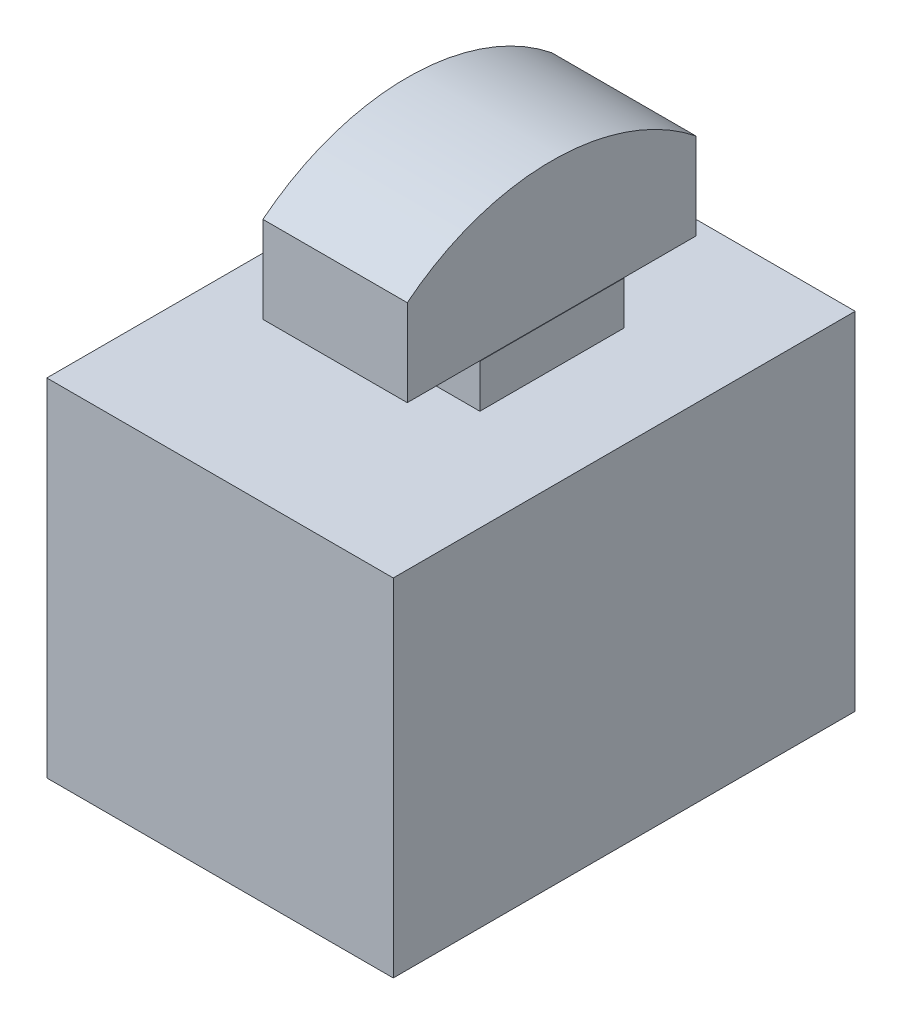
ISO-10303-21;
HEADER;
FILE_DESCRIPTION(('STEP AP214'),'2;1');
FILE_NAME('part.step','',(''),(''),'','','');
FILE_SCHEMA(('AUTOMOTIVE_DESIGN { 1 0 10303 214 1 1 1 1 }'));
ENDSEC;
DATA;
#1=APPLICATION_CONTEXT('core data for automotive mechanical design processes');
#2=APPLICATION_PROTOCOL_DEFINITION('international standard','automotive_design',2000,#1);
#3=PRODUCT_CONTEXT('',#1,'mechanical');
#4=PRODUCT('Part','Part','',(#3));
#5=PRODUCT_RELATED_PRODUCT_CATEGORY('part','',(#4));
#6=PRODUCT_DEFINITION_FORMATION('','',#4);
#7=PRODUCT_DEFINITION_CONTEXT('part definition',#1,'design');
#8=PRODUCT_DEFINITION('design','',#6,#7);
#9=PRODUCT_DEFINITION_SHAPE('','',#8);
#10=(LENGTH_UNIT() NAMED_UNIT(*) SI_UNIT(.MILLI.,.METRE.));
#11=(NAMED_UNIT(*) PLANE_ANGLE_UNIT() SI_UNIT($,.RADIAN.));
#12=(NAMED_UNIT(*) SI_UNIT($,.STERADIAN.) SOLID_ANGLE_UNIT());
#13=UNCERTAINTY_MEASURE_WITH_UNIT(LENGTH_MEASURE(1.E-05),#10,'distance_accuracy_value','');
#14=(GEOMETRIC_REPRESENTATION_CONTEXT(3) GLOBAL_UNCERTAINTY_ASSIGNED_CONTEXT((#13)) GLOBAL_UNIT_ASSIGNED_CONTEXT((#10,
#11,#12)) REPRESENTATION_CONTEXT('',''));
#15=CARTESIAN_POINT('',(0.,0.,0.));
#16=DIRECTION('',(0.,0.,1.));
#17=DIRECTION('',(1.,0.,0.));
#18=AXIS2_PLACEMENT_3D('',#15,#16,#17);
#19=CARTESIAN_POINT('',(-6.,6.,16.));
#20=DIRECTION('',(0.,-1.,0.));
#21=DIRECTION('',(0.,0.,-1.));
#22=AXIS2_PLACEMENT_3D('',#19,#20,#21);
#23=PLANE('',#22);
#24=DIRECTION('',(-1.,0.,0.));
#25=VECTOR('',#24,1.);
#26=CARTESIAN_POINT('',(-6.,6.,0.));
#27=LINE('',#26,#25);
#28=CARTESIAN_POINT('',(6.,6.,0.));
#29=VERTEX_POINT('',#28);
#30=CARTESIAN_POINT('',(-6.,6.,0.));
#31=VERTEX_POINT('',#30);
#32=EDGE_CURVE('E258',#29,#31,#27,.T.);
#33=ORIENTED_EDGE('',*,*,#32,.T.);
#34=DIRECTION('',(0.,0.,-1.));
#35=VECTOR('',#34,1.);
#36=CARTESIAN_POINT('',(-6.,6.,16.));
#37=LINE('',#36,#35);
#38=CARTESIAN_POINT('',(-6.,6.,16.));
#39=VERTEX_POINT('',#38);
#40=EDGE_CURVE('E272',#39,#31,#37,.T.);
#41=ORIENTED_EDGE('',*,*,#40,.F.);
#42=DIRECTION('',(-1.,0.,0.));
#43=VECTOR('',#42,1.);
#44=CARTESIAN_POINT('',(-6.,6.,16.));
#45=LINE('',#44,#43);
#46=CARTESIAN_POINT('',(6.,6.,16.));
#47=VERTEX_POINT('',#46);
#48=EDGE_CURVE('E244',#47,#39,#45,.T.);
#49=ORIENTED_EDGE('',*,*,#48,.F.);
#50=DIRECTION('',(0.,0.,-1.));
#51=VECTOR('',#50,1.);
#52=CARTESIAN_POINT('',(6.,6.,16.));
#53=LINE('',#52,#51);
#54=EDGE_CURVE('E46',#47,#29,#53,.T.);
#55=ORIENTED_EDGE('',*,*,#54,.T.);
#56=EDGE_LOOP('',(#33,#41,#49,#55));
#57=FACE_BOUND('',#56,.T.);
#58=DIRECTION('',(0.,0.,-1.));
#59=VECTOR('',#58,1.);
#60=CARTESIAN_POINT('',(2.5,6.,4.5));
#61=LINE('',#60,#59);
#62=CARTESIAN_POINT('',(2.5,6.,9.5));
#63=VERTEX_POINT('',#62);
#64=CARTESIAN_POINT('',(2.5,6.,4.5));
#65=VERTEX_POINT('',#64);
#66=EDGE_CURVE('E67',#63,#65,#61,.T.);
#67=ORIENTED_EDGE('',*,*,#66,.F.);
#68=DIRECTION('',(1.,0.,0.));
#69=VECTOR('',#68,1.);
#70=CARTESIAN_POINT('',(-2.5,6.,9.5));
#71=LINE('',#70,#69);
#72=CARTESIAN_POINT('',(-2.5,6.,9.5));
#73=VERTEX_POINT('',#72);
#74=EDGE_CURVE('E198',#73,#63,#71,.T.);
#75=ORIENTED_EDGE('',*,*,#74,.F.);
#76=DIRECTION('',(0.,0.,1.));
#77=VECTOR('',#76,1.);
#78=CARTESIAN_POINT('',(-2.5,6.,4.5));
#79=LINE('',#78,#77);
#80=CARTESIAN_POINT('',(-2.5,6.,4.5));
#81=VERTEX_POINT('',#80);
#82=EDGE_CURVE('E218',#81,#73,#79,.T.);
#83=ORIENTED_EDGE('',*,*,#82,.F.);
#84=DIRECTION('',(-1.,0.,0.));
#85=VECTOR('',#84,1.);
#86=CARTESIAN_POINT('',(-2.5,6.,4.5));
#87=LINE('',#86,#85);
#88=EDGE_CURVE('E214',#65,#81,#87,.T.);
#89=ORIENTED_EDGE('',*,*,#88,.F.);
#90=EDGE_LOOP('',(#67,#75,#83,#89));
#91=FACE_BOUND('',#90,.T.);
#92=ADVANCED_FACE('F42',(#57,#91),#23,.F.);
#93=CARTESIAN_POINT('',(6.,6.,16.));
#94=DIRECTION('',(-1.,0.,0.));
#95=DIRECTION('',(0.,-1.,0.));
#96=AXIS2_PLACEMENT_3D('',#93,#94,#95);
#97=PLANE('',#96);
#98=DIRECTION('',(0.,1.,0.));
#99=VECTOR('',#98,1.);
#100=CARTESIAN_POINT('',(6.,6.,0.));
#101=LINE('',#100,#99);
#102=CARTESIAN_POINT('',(6.,-6.,0.));
#103=VERTEX_POINT('',#102);
#104=EDGE_CURVE('E239',#103,#29,#101,.T.);
#105=ORIENTED_EDGE('',*,*,#104,.T.);
#106=ORIENTED_EDGE('',*,*,#54,.F.);
#107=DIRECTION('',(0.,1.,0.));
#108=VECTOR('',#107,1.);
#109=CARTESIAN_POINT('',(6.,6.,16.));
#110=LINE('',#109,#108);
#111=CARTESIAN_POINT('',(6.,-6.,16.));
#112=VERTEX_POINT('',#111);
#113=EDGE_CURVE('E240',#112,#47,#110,.T.);
#114=ORIENTED_EDGE('',*,*,#113,.F.);
#115=DIRECTION('',(0.,0.,-1.));
#116=VECTOR('',#115,1.);
#117=CARTESIAN_POINT('',(6.,-6.,16.));
#118=LINE('',#117,#116);
#119=EDGE_CURVE('E254',#112,#103,#118,.T.);
#120=ORIENTED_EDGE('',*,*,#119,.T.);
#121=EDGE_LOOP('',(#105,#106,#114,#120));
#122=FACE_BOUND('',#121,.T.);
#123=ADVANCED_FACE('F44',(#122),#97,.F.);
#124=CARTESIAN_POINT('',(-6.,6.,16.));
#125=DIRECTION('',(1.,0.,0.));
#126=DIRECTION('',(0.,1.,0.));
#127=AXIS2_PLACEMENT_3D('',#124,#125,#126);
#128=PLANE('',#127);
#129=DIRECTION('',(0.,-1.,0.));
#130=VECTOR('',#129,1.);
#131=CARTESIAN_POINT('',(-6.,6.,0.));
#132=LINE('',#131,#130);
#133=CARTESIAN_POINT('',(-6.,-6.,0.));
#134=VERTEX_POINT('',#133);
#135=EDGE_CURVE('E261',#31,#134,#132,.T.);
#136=ORIENTED_EDGE('',*,*,#135,.T.);
#137=DIRECTION('',(0.,0.,-1.));
#138=VECTOR('',#137,1.);
#139=CARTESIAN_POINT('',(-6.,-6.,16.));
#140=LINE('',#139,#138);
#141=CARTESIAN_POINT('',(-6.,-6.,16.));
#142=VERTEX_POINT('',#141);
#143=EDGE_CURVE('E269',#142,#134,#140,.T.);
#144=ORIENTED_EDGE('',*,*,#143,.F.);
#145=DIRECTION('',(0.,-1.,0.));
#146=VECTOR('',#145,1.);
#147=CARTESIAN_POINT('',(-6.,6.,16.));
#148=LINE('',#147,#146);
#149=EDGE_CURVE('E248',#39,#142,#148,.T.);
#150=ORIENTED_EDGE('',*,*,#149,.F.);
#151=ORIENTED_EDGE('',*,*,#40,.T.);
#152=EDGE_LOOP('',(#136,#144,#150,#151));
#153=FACE_BOUND('',#152,.T.);
#154=ADVANCED_FACE('F291',(#153),#128,.F.);
#155=CARTESIAN_POINT('',(-6.,-6.,16.));
#156=DIRECTION('',(0.,1.,0.));
#157=DIRECTION('',(0.,0.,1.));
#158=AXIS2_PLACEMENT_3D('',#155,#156,#157);
#159=PLANE('',#158);
#160=DIRECTION('',(1.,0.,0.));
#161=VECTOR('',#160,1.);
#162=CARTESIAN_POINT('',(-6.,-6.,0.));
#163=LINE('',#162,#161);
#164=EDGE_CURVE('E245',#134,#103,#163,.T.);
#165=ORIENTED_EDGE('',*,*,#164,.T.);
#166=ORIENTED_EDGE('',*,*,#119,.F.);
#167=DIRECTION('',(1.,0.,0.));
#168=VECTOR('',#167,1.);
#169=CARTESIAN_POINT('',(-6.,-6.,16.));
#170=LINE('',#169,#168);
#171=EDGE_CURVE('E251',#142,#112,#170,.T.);
#172=ORIENTED_EDGE('',*,*,#171,.F.);
#173=ORIENTED_EDGE('',*,*,#143,.T.);
#174=EDGE_LOOP('',(#165,#166,#172,#173));
#175=FACE_BOUND('',#174,.T.);
#176=ADVANCED_FACE('F294',(#175),#159,.F.);
#177=CARTESIAN_POINT('',(0.,0.,16.));
#178=DIRECTION('',(0.,0.,1.));
#179=DIRECTION('',(1.,0.,0.));
#180=AXIS2_PLACEMENT_3D('',#177,#178,#179);
#181=PLANE('',#180);
#182=ORIENTED_EDGE('',*,*,#113,.T.);
#183=ORIENTED_EDGE('',*,*,#48,.T.);
#184=ORIENTED_EDGE('',*,*,#149,.T.);
#185=ORIENTED_EDGE('',*,*,#171,.T.);
#186=EDGE_LOOP('',(#182,#183,#184,#185));
#187=FACE_BOUND('',#186,.T.);
#188=ADVANCED_FACE('F296',(#187),#181,.T.);
#189=CARTESIAN_POINT('',(0.,0.,0.));
#190=DIRECTION('',(0.,0.,1.));
#191=DIRECTION('',(1.,0.,0.));
#192=AXIS2_PLACEMENT_3D('',#189,#190,#191);
#193=PLANE('',#192);
#194=ORIENTED_EDGE('',*,*,#104,.F.);
#195=ORIENTED_EDGE('',*,*,#164,.F.);
#196=ORIENTED_EDGE('',*,*,#135,.F.);
#197=ORIENTED_EDGE('',*,*,#32,.F.);
#198=EDGE_LOOP('',(#194,#195,#196,#197));
#199=FACE_BOUND('',#198,.T.);
#200=ADVANCED_FACE('F289',(#199),#193,.F.);
#201=CARTESIAN_POINT('',(2.5,7.5,4.5));
#202=DIRECTION('',(-1.,0.,0.));
#203=DIRECTION('',(0.,0.,1.));
#204=AXIS2_PLACEMENT_3D('',#201,#202,#203);
#205=PLANE('',#204);
#206=ORIENTED_EDGE('',*,*,#66,.T.);
#207=DIRECTION('',(0.,-1.,0.));
#208=VECTOR('',#207,1.);
#209=CARTESIAN_POINT('',(2.5,7.5,4.5));
#210=LINE('',#209,#208);
#211=CARTESIAN_POINT('',(2.5,7.5,4.5));
#212=VERTEX_POINT('',#211);
#213=EDGE_CURVE('E235',#212,#65,#210,.T.);
#214=ORIENTED_EDGE('',*,*,#213,.F.);
#215=DIRECTION('',(0.,0.,-1.));
#216=VECTOR('',#215,1.);
#217=CARTESIAN_POINT('',(2.5,7.5,4.5));
#218=LINE('',#217,#216);
#219=CARTESIAN_POINT('',(2.5,7.5,9.5));
#220=VERTEX_POINT('',#219);
#221=EDGE_CURVE('E193',#220,#212,#218,.T.);
#222=ORIENTED_EDGE('',*,*,#221,.F.);
#223=DIRECTION('',(0.,-1.,0.));
#224=VECTOR('',#223,1.);
#225=CARTESIAN_POINT('',(2.5,7.5,9.5));
#226=LINE('',#225,#224);
#227=EDGE_CURVE('E211',#220,#63,#226,.T.);
#228=ORIENTED_EDGE('',*,*,#227,.T.);
#229=EDGE_LOOP('',(#206,#214,#222,#228));
#230=FACE_BOUND('',#229,.T.);
#231=ADVANCED_FACE('F303',(#230),#205,.F.);
#232=CARTESIAN_POINT('',(-2.5,7.5,4.5));
#233=DIRECTION('',(0.,0.,1.));
#234=DIRECTION('',(1.,0.,0.));
#235=AXIS2_PLACEMENT_3D('',#232,#233,#234);
#236=PLANE('',#235);
#237=ORIENTED_EDGE('',*,*,#88,.T.);
#238=DIRECTION('',(0.,-1.,0.));
#239=VECTOR('',#238,1.);
#240=CARTESIAN_POINT('',(-2.5,7.5,4.5));
#241=LINE('',#240,#239);
#242=CARTESIAN_POINT('',(-2.5,7.5,4.5));
#243=VERTEX_POINT('',#242);
#244=EDGE_CURVE('E231',#243,#81,#241,.T.);
#245=ORIENTED_EDGE('',*,*,#244,.F.);
#246=DIRECTION('',(-1.,0.,0.));
#247=VECTOR('',#246,1.);
#248=CARTESIAN_POINT('',(-2.5,7.5,4.5));
#249=LINE('',#248,#247);
#250=CARTESIAN_POINT('',(2.48503253117146,7.5,4.5));
#251=VERTEX_POINT('',#250);
#252=EDGE_CURVE('E197',#251,#243,#249,.T.);
#253=ORIENTED_EDGE('',*,*,#252,.F.);
#254=EDGE_CURVE('E199',#212,#251,#249,.T.);
#255=ORIENTED_EDGE('',*,*,#254,.F.);
#256=ORIENTED_EDGE('',*,*,#213,.T.);
#257=EDGE_LOOP('',(#237,#245,#253,#255,#256));
#258=FACE_BOUND('',#257,.T.);
#259=ADVANCED_FACE('F348',(#258),#236,.F.);
#260=CARTESIAN_POINT('',(-2.5,7.5,4.5));
#261=DIRECTION('',(1.,0.,0.));
#262=DIRECTION('',(0.,0.,-1.));
#263=AXIS2_PLACEMENT_3D('',#260,#261,#262);
#264=PLANE('',#263);
#265=ORIENTED_EDGE('',*,*,#82,.T.);
#266=DIRECTION('',(0.,-1.,0.));
#267=VECTOR('',#266,1.);
#268=CARTESIAN_POINT('',(-2.5,7.5,9.5));
#269=LINE('',#268,#267);
#270=CARTESIAN_POINT('',(-2.5,7.5,9.5));
#271=VERTEX_POINT('',#270);
#272=EDGE_CURVE('E227',#271,#73,#269,.T.);
#273=ORIENTED_EDGE('',*,*,#272,.F.);
#274=DIRECTION('',(0.,0.,1.));
#275=VECTOR('',#274,1.);
#276=CARTESIAN_POINT('',(-2.5,7.5,4.5));
#277=LINE('',#276,#275);
#278=EDGE_CURVE('E202',#243,#271,#277,.T.);
#279=ORIENTED_EDGE('',*,*,#278,.F.);
#280=ORIENTED_EDGE('',*,*,#244,.T.);
#281=EDGE_LOOP('',(#265,#273,#279,#280));
#282=FACE_BOUND('',#281,.T.);
#283=ADVANCED_FACE('F357',(#282),#264,.F.);
#284=CARTESIAN_POINT('',(-2.5,7.5,9.5));
#285=DIRECTION('',(0.,0.,-1.));
#286=DIRECTION('',(-1.,0.,0.));
#287=AXIS2_PLACEMENT_3D('',#284,#285,#286);
#288=PLANE('',#287);
#289=ORIENTED_EDGE('',*,*,#74,.T.);
#290=ORIENTED_EDGE('',*,*,#227,.F.);
#291=DIRECTION('',(1.,0.,0.));
#292=VECTOR('',#291,1.);
#293=CARTESIAN_POINT('',(-2.5,7.5,9.5));
#294=LINE('',#293,#292);
#295=CARTESIAN_POINT('',(2.48503253117146,7.5,9.5));
#296=VERTEX_POINT('',#295);
#297=EDGE_CURVE('E206',#296,#220,#294,.T.);
#298=ORIENTED_EDGE('',*,*,#297,.F.);
#299=EDGE_CURVE('E207',#271,#296,#294,.T.);
#300=ORIENTED_EDGE('',*,*,#299,.F.);
#301=ORIENTED_EDGE('',*,*,#272,.T.);
#302=EDGE_LOOP('',(#289,#290,#298,#300,#301));
#303=FACE_BOUND('',#302,.T.);
#304=ADVANCED_FACE('F368',(#303),#288,.F.);
#305=CARTESIAN_POINT('',(0.,7.5,0.));
#306=DIRECTION('',(0.,1.,0.));
#307=DIRECTION('',(0.,0.,1.));
#308=AXIS2_PLACEMENT_3D('',#305,#306,#307);
#309=PLANE('',#308);
#310=DIRECTION('',(0.,0.,-1.));
#311=VECTOR('',#310,1.);
#312=CARTESIAN_POINT('',(2.48503253117146,7.5,2.));
#313=LINE('',#312,#311);
#314=EDGE_CURVE('E11',#296,#251,#313,.T.);
#315=ORIENTED_EDGE('',*,*,#314,.F.);
#316=ORIENTED_EDGE('',*,*,#297,.T.);
#317=ORIENTED_EDGE('',*,*,#221,.T.);
#318=ORIENTED_EDGE('',*,*,#254,.T.);
#319=EDGE_LOOP('',(#315,#316,#317,#318));
#320=FACE_BOUND('',#319,.T.);
#321=ADVANCED_FACE('F379',(#320),#309,.T.);
#322=CARTESIAN_POINT('',(0.,7.5,0.));
#323=DIRECTION('',(0.,1.,0.));
#324=DIRECTION('',(0.,0.,1.));
#325=AXIS2_PLACEMENT_3D('',#322,#323,#324);
#326=PLANE('',#325);
#327=CARTESIAN_POINT('',(2.48503253117146,7.5,2.));
#328=VERTEX_POINT('',#327);
#329=EDGE_CURVE('E54',#251,#328,#313,.T.);
#330=ORIENTED_EDGE('',*,*,#329,.F.);
#331=ORIENTED_EDGE('',*,*,#252,.T.);
#332=ORIENTED_EDGE('',*,*,#278,.T.);
#333=ORIENTED_EDGE('',*,*,#299,.T.);
#334=CARTESIAN_POINT('',(2.48503253117146,7.5,12.));
#335=VERTEX_POINT('',#334);
#336=EDGE_CURVE('E53',#335,#296,#313,.T.);
#337=ORIENTED_EDGE('',*,*,#336,.F.);
#338=DIRECTION('',(1.,0.,0.));
#339=VECTOR('',#338,1.);
#340=CARTESIAN_POINT('',(-2.51496746882854,7.5,12.));
#341=LINE('',#340,#339);
#342=CARTESIAN_POINT('',(-2.51496746882854,7.5,12.));
#343=VERTEX_POINT('',#342);
#344=EDGE_CURVE('E162',#343,#335,#341,.T.);
#345=ORIENTED_EDGE('',*,*,#344,.F.);
#346=DIRECTION('',(0.,0.,1.));
#347=VECTOR('',#346,1.);
#348=CARTESIAN_POINT('',(-2.51496746882854,7.5,2.));
#349=LINE('',#348,#347);
#350=CARTESIAN_POINT('',(-2.51496746882854,7.5,2.));
#351=VERTEX_POINT('',#350);
#352=EDGE_CURVE('E180',#351,#343,#349,.T.);
#353=ORIENTED_EDGE('',*,*,#352,.F.);
#354=DIRECTION('',(-1.,0.,0.));
#355=VECTOR('',#354,1.);
#356=CARTESIAN_POINT('',(-2.51496746882854,7.5,2.));
#357=LINE('',#356,#355);
#358=EDGE_CURVE('E177',#328,#351,#357,.T.);
#359=ORIENTED_EDGE('',*,*,#358,.F.);
#360=EDGE_LOOP('',(#330,#331,#332,#333,#337,#345,#353,#359));
#361=FACE_BOUND('',#360,.T.);
#362=ADVANCED_FACE('F390',(#361),#326,.F.);
#363=CARTESIAN_POINT('',(2.48503253117146,10.5,2.));
#364=DIRECTION('',(-1.,0.,0.));
#365=DIRECTION('',(0.,0.,1.));
#366=AXIS2_PLACEMENT_3D('',#363,#364,#365);
#367=PLANE('',#366);
#368=ORIENTED_EDGE('',*,*,#336,.T.);
#369=ORIENTED_EDGE('',*,*,#314,.T.);
#370=ORIENTED_EDGE('',*,*,#329,.T.);
#371=DIRECTION('',(0.,-1.,0.));
#372=VECTOR('',#371,1.);
#373=CARTESIAN_POINT('',(2.48503253117146,10.5,2.));
#374=LINE('',#373,#372);
#375=CARTESIAN_POINT('',(2.48503253117146,10.5,2.));
#376=VERTEX_POINT('',#375);
#377=EDGE_CURVE('E139',#376,#328,#374,.T.);
#378=ORIENTED_EDGE('',*,*,#377,.F.);
#379=CARTESIAN_POINT('',(2.48503253117146,4.25500200160161,7.));
#380=DIRECTION('',(-1.,0.,0.));
#381=DIRECTION('',(0.,0.,1.));
#382=AXIS2_PLACEMENT_3D('',#379,#380,#381);
#383=CIRCLE('',#382,8.);
#384=CARTESIAN_POINT('',(2.48503253117146,10.5,12.));
#385=VERTEX_POINT('',#384);
#386=EDGE_CURVE('E145',#376,#385,#383,.F.);
#387=ORIENTED_EDGE('',*,*,#386,.T.);
#388=DIRECTION('',(0.,-1.,0.));
#389=VECTOR('',#388,1.);
#390=CARTESIAN_POINT('',(2.48503253117146,10.5,12.));
#391=LINE('',#390,#389);
#392=EDGE_CURVE('E174',#385,#335,#391,.T.);
#393=ORIENTED_EDGE('',*,*,#392,.T.);
#394=EDGE_LOOP('',(#368,#369,#370,#378,#387,#393));
#395=FACE_BOUND('',#394,.T.);
#396=ADVANCED_FACE('F142',(#395),#367,.F.);
#397=CARTESIAN_POINT('',(-2.51496746882854,10.5,2.));
#398=DIRECTION('',(0.,0.,1.));
#399=DIRECTION('',(1.,0.,0.));
#400=AXIS2_PLACEMENT_3D('',#397,#398,#399);
#401=PLANE('',#400);
#402=ORIENTED_EDGE('',*,*,#358,.T.);
#403=DIRECTION('',(0.,-1.,0.));
#404=VECTOR('',#403,1.);
#405=CARTESIAN_POINT('',(-2.51496746882854,10.5,2.));
#406=LINE('',#405,#404);
#407=CARTESIAN_POINT('',(-2.51496746882854,10.5,2.));
#408=VERTEX_POINT('',#407);
#409=EDGE_CURVE('E151',#408,#351,#406,.T.);
#410=ORIENTED_EDGE('',*,*,#409,.F.);
#411=DIRECTION('',(-1.,0.,0.));
#412=VECTOR('',#411,1.);
#413=CARTESIAN_POINT('',(-2.51496746882854,10.5,2.));
#414=LINE('',#413,#412);
#415=EDGE_CURVE('E154',#376,#408,#414,.T.);
#416=ORIENTED_EDGE('',*,*,#415,.F.);
#417=ORIENTED_EDGE('',*,*,#377,.T.);
#418=EDGE_LOOP('',(#402,#410,#416,#417));
#419=FACE_BOUND('',#418,.T.);
#420=ADVANCED_FACE('F155',(#419),#401,.F.);
#421=CARTESIAN_POINT('',(-2.51496746882854,10.5,2.));
#422=DIRECTION('',(1.,0.,0.));
#423=DIRECTION('',(0.,0.,-1.));
#424=AXIS2_PLACEMENT_3D('',#421,#422,#423);
#425=PLANE('',#424);
#426=ORIENTED_EDGE('',*,*,#352,.T.);
#427=DIRECTION('',(0.,-1.,0.));
#428=VECTOR('',#427,1.);
#429=CARTESIAN_POINT('',(-2.51496746882854,10.5,12.));
#430=LINE('',#429,#428);
#431=CARTESIAN_POINT('',(-2.51496746882854,10.5,12.));
#432=VERTEX_POINT('',#431);
#433=EDGE_CURVE('E187',#432,#343,#430,.T.);
#434=ORIENTED_EDGE('',*,*,#433,.F.);
#435=CARTESIAN_POINT('',(-2.51496746882854,4.25500200160161,7.));
#436=DIRECTION('',(-1.,0.,0.));
#437=DIRECTION('',(0.,0.,-1.));
#438=AXIS2_PLACEMENT_3D('',#435,#436,#437);
#439=CIRCLE('',#438,8.);
#440=EDGE_CURVE('E167',#432,#408,#439,.T.);
#441=ORIENTED_EDGE('',*,*,#440,.T.);
#442=ORIENTED_EDGE('',*,*,#409,.T.);
#443=EDGE_LOOP('',(#426,#434,#441,#442));
#444=FACE_BOUND('',#443,.T.);
#445=ADVANCED_FACE('F421',(#444),#425,.F.);
#446=CARTESIAN_POINT('',(-2.51496746882854,10.5,12.));
#447=DIRECTION('',(0.,0.,-1.));
#448=DIRECTION('',(-1.,0.,0.));
#449=AXIS2_PLACEMENT_3D('',#446,#447,#448);
#450=PLANE('',#449);
#451=ORIENTED_EDGE('',*,*,#344,.T.);
#452=ORIENTED_EDGE('',*,*,#392,.F.);
#453=DIRECTION('',(1.,0.,0.));
#454=VECTOR('',#453,1.);
#455=CARTESIAN_POINT('',(-2.51496746882854,10.5,12.));
#456=LINE('',#455,#454);
#457=EDGE_CURVE('E161',#432,#385,#456,.T.);
#458=ORIENTED_EDGE('',*,*,#457,.F.);
#459=ORIENTED_EDGE('',*,*,#433,.T.);
#460=EDGE_LOOP('',(#451,#452,#458,#459));
#461=FACE_BOUND('',#460,.T.);
#462=ADVANCED_FACE('F431',(#461),#450,.F.);
#463=CARTESIAN_POINT('',(12.6378662255459,4.25500200160161,7.));
#464=DIRECTION('',(-1.,0.,0.));
#465=DIRECTION('',(0.,0.,1.));
#466=AXIS2_PLACEMENT_3D('',#463,#464,#465);
#467=CYLINDRICAL_SURFACE('',#466,8.);
#468=ORIENTED_EDGE('',*,*,#386,.F.);
#469=ORIENTED_EDGE('',*,*,#415,.T.);
#470=ORIENTED_EDGE('',*,*,#440,.F.);
#471=ORIENTED_EDGE('',*,*,#457,.T.);
#472=EDGE_LOOP('',(#468,#469,#470,#471));
#473=FACE_BOUND('',#472,.T.);
#474=ADVANCED_FACE('F164',(#473),#467,.T.);
#475=CLOSED_SHELL('',(#92,#123,#154,#176,#188,#200,#231,#259,#283,#304,#321,#362,#396,#420,#445,
#462,#474));
#476=MANIFOLD_SOLID_BREP('B2',#475);
#477=ADVANCED_BREP_SHAPE_REPRESENTATION('',(#18,#476),#14);
#478=SHAPE_DEFINITION_REPRESENTATION(#9,#477);
ENDSEC;
END-ISO-10303-21;
